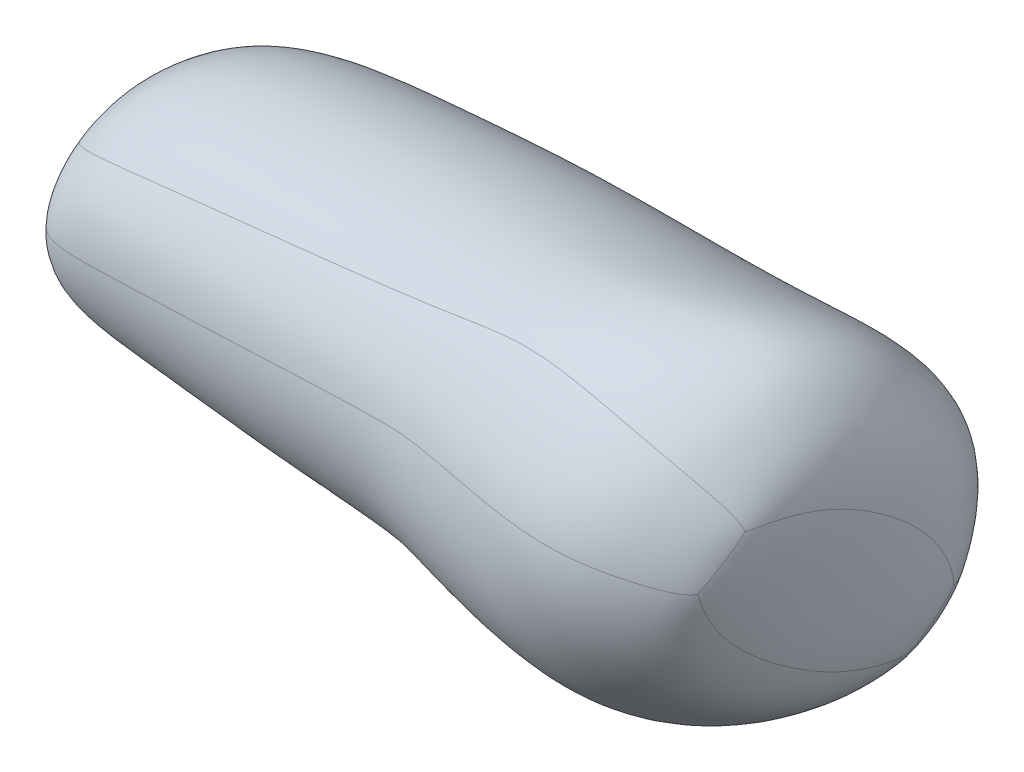
ISO-10303-21;
HEADER;
FILE_DESCRIPTION(('STEP AP214'),'2;1');
FILE_NAME('part.step','',(''),(''),'','','');
FILE_SCHEMA(('AUTOMOTIVE_DESIGN { 1 0 10303 214 1 1 1 1 }'));
ENDSEC;
DATA;
#1=APPLICATION_CONTEXT('core data for automotive mechanical design processes');
#2=APPLICATION_PROTOCOL_DEFINITION('international standard','automotive_design',2000,#1);
#3=PRODUCT_CONTEXT('',#1,'mechanical');
#4=PRODUCT('Part','Part','',(#3));
#5=PRODUCT_RELATED_PRODUCT_CATEGORY('part','',(#4));
#6=PRODUCT_DEFINITION_FORMATION('','',#4);
#7=PRODUCT_DEFINITION_CONTEXT('part definition',#1,'design');
#8=PRODUCT_DEFINITION('design','',#6,#7);
#9=PRODUCT_DEFINITION_SHAPE('','',#8);
#10=(LENGTH_UNIT() NAMED_UNIT(*) SI_UNIT(.MILLI.,.METRE.));
#11=(NAMED_UNIT(*) PLANE_ANGLE_UNIT() SI_UNIT($,.RADIAN.));
#12=(NAMED_UNIT(*) SI_UNIT($,.STERADIAN.) SOLID_ANGLE_UNIT());
#13=UNCERTAINTY_MEASURE_WITH_UNIT(LENGTH_MEASURE(1.E-05),#10,'distance_accuracy_value','');
#14=(GEOMETRIC_REPRESENTATION_CONTEXT(3) GLOBAL_UNCERTAINTY_ASSIGNED_CONTEXT((#13)) GLOBAL_UNIT_ASSIGNED_CONTEXT((#10,
#11,#12)) REPRESENTATION_CONTEXT('',''));
#15=CARTESIAN_POINT('',(0.,0.,0.));
#16=DIRECTION('',(0.,0.,1.));
#17=DIRECTION('',(1.,0.,0.));
#18=AXIS2_PLACEMENT_3D('',#15,#16,#17);
#19=CARTESIAN_POINT('',(-701.316035070471,1293.10943394566,-66.2994256879517));
#20=CARTESIAN_POINT('',(-701.628362751821,1293.05525842378,-65.9004162034461));
#21=CARTESIAN_POINT('',(-703.004641856583,1293.39929126228,-64.8374064802361));
#22=CARTESIAN_POINT('',(-706.461876633561,1294.08888908063,-63.3597857782156));
#23=CARTESIAN_POINT('',(-712.8462746859,1294.4758915348,-64.5136757659904));
#24=CARTESIAN_POINT('',(-715.279985083614,1294.04078869131,-64.9687179233393));
#25=CARTESIAN_POINT('',(-719.258570034694,1293.4376534686,-65.4506030178518));
#26=CARTESIAN_POINT('',(-723.565517325338,1292.80853719028,-65.8781008945618));
#27=CARTESIAN_POINT('',(-728.772502794879,1292.22176565615,-66.3143519553914));
#28=CARTESIAN_POINT('',(-732.617688854254,1291.85219883372,-66.5114804740266));
#29=CARTESIAN_POINT('',(-734.023346267989,1291.51385059072,-67.8652325400091));
#30=CARTESIAN_POINT('',(-734.498250658246,1291.38662519744,-70.3147613121822));
#31=CARTESIAN_POINT('',(-734.711399020064,1291.30984347028,-71.5942006821782));
#32=CARTESIAN_POINT('',(-734.731721017388,1291.35435848152,-71.866890666019));
#33=CARTESIAN_POINT('',(-701.259243366843,1292.62991775251,-66.3706867742273));
#34=CARTESIAN_POINT('',(-701.827107025942,1292.04205051556,-65.6439288914806));
#35=CARTESIAN_POINT('',(-703.292272627499,1292.16197347223,-64.491249850753));
#36=CARTESIAN_POINT('',(-706.897062603272,1292.41909062429,-62.9041161738302));
#37=CARTESIAN_POINT('',(-713.665879950692,1292.76977946586,-64.1805295441065));
#38=CARTESIAN_POINT('',(-715.725165791082,1292.48208956764,-64.7176039383368));
#39=CARTESIAN_POINT('',(-719.636619420401,1291.94516368584,-65.2689409016937));
#40=CARTESIAN_POINT('',(-723.941839959848,1291.36760342231,-65.7588164651027));
#41=CARTESIAN_POINT('',(-729.039819050765,1290.8927888255,-66.2707340060862));
#42=CARTESIAN_POINT('',(-732.698768894406,1290.623558216,-66.5204144837296));
#43=CARTESIAN_POINT('',(-734.058818220358,1290.50680640568,-67.857160743771));
#44=CARTESIAN_POINT('',(-734.518538885319,1290.7170169393,-70.3029220528484));
#45=CARTESIAN_POINT('',(-734.725513757758,1290.86549528866,-71.5864363447796));
#46=CARTESIAN_POINT('',(-734.748939384897,1291.15444189635,-71.9993534892401));
#47=CARTESIAN_POINT('',(-701.217421140593,1291.00795596354,-66.977315389934));
#48=CARTESIAN_POINT('',(-701.932547505376,1289.93134690237,-65.9494442454508));
#49=CARTESIAN_POINT('',(-703.537718974076,1289.64924805076,-64.7443405676878));
#50=CARTESIAN_POINT('',(-707.217521788779,1288.94036471283,-63.1121443146891));
#51=CARTESIAN_POINT('',(-714.416789764512,1289.30345667267,-64.6438524465018));
#52=CARTESIAN_POINT('',(-716.129813592438,1289.20821928462,-65.3027138007696));
#53=CARTESIAN_POINT('',(-720.034532553235,1288.78729253856,-65.8913603812614));
#54=CARTESIAN_POINT('',(-724.327485963588,1288.37709592915,-66.4467161505811));
#55=CARTESIAN_POINT('',(-729.214915005947,1288.20739179088,-67.0971392662938));
#56=CARTESIAN_POINT('',(-732.504733582318,1288.17758368197,-67.4535885793009));
#57=CARTESIAN_POINT('',(-733.916103426511,1288.50116506403,-68.6080783327037));
#58=CARTESIAN_POINT('',(-734.419809848835,1289.37407369262,-70.7589283159264));
#59=CARTESIAN_POINT('',(-734.663809182999,1289.97450057104,-71.8881637309372));
#60=CARTESIAN_POINT('',(-734.6835069016,1290.54916229157,-72.3228405724555));
#61=CARTESIAN_POINT('',(-700.711549450989,1288.90391840133,-69.2981814722913));
#62=CARTESIAN_POINT('',(-701.397823915827,1287.50799214454,-68.2179664249885));
#63=CARTESIAN_POINT('',(-703.001156894259,1286.38879569559,-67.3409021374589));
#64=CARTESIAN_POINT('',(-706.122730580127,1284.77173657121,-66.4203870104189));
#65=CARTESIAN_POINT('',(-713.095320425053,1285.10868732093,-68.1855474462987));
#66=CARTESIAN_POINT('',(-715.040298618289,1285.16321353457,-69.0318216299948));
#67=CARTESIAN_POINT('',(-719.120903766518,1285.02925848321,-69.6569251433747));
#68=CARTESIAN_POINT('',(-723.188924719288,1285.02097206484,-70.2699584252765));
#69=CARTESIAN_POINT('',(-728.134147969328,1285.31458013056,-70.9896361765153));
#70=CARTESIAN_POINT('',(-731.519390276312,1285.53221519774,-71.3637790681329));
#71=CARTESIAN_POINT('',(-733.373090938575,1286.36525136083,-71.7982036117811));
#72=CARTESIAN_POINT('',(-734.079150993543,1288.03572313809,-72.6867734449413));
#73=CARTESIAN_POINT('',(-734.442798515043,1289.09352451446,-73.1626858141456));
#74=CARTESIAN_POINT('',(-734.491354899545,1289.86781889685,-73.5022293845369));
#75=CARTESIAN_POINT('',(-699.966811510782,1287.44696455059,-72.1550714404489));
#76=CARTESIAN_POINT('',(-700.490059361611,1286.1695549403,-71.3681197746935));
#77=CARTESIAN_POINT('',(-701.801467118573,1284.91273596587,-71.3678842654787));
#78=CARTESIAN_POINT('',(-704.389616218064,1282.86288929533,-71.8094416367998));
#79=CARTESIAN_POINT('',(-710.682486461217,1283.35700947776,-73.0311918095691));
#80=CARTESIAN_POINT('',(-713.041786336386,1283.77799194608,-73.7949097808927));
#81=CARTESIAN_POINT('',(-717.221214515267,1284.07034510417,-74.5716058365903));
#82=CARTESIAN_POINT('',(-721.300971002899,1284.25717986953,-75.1359521184537));
#83=CARTESIAN_POINT('',(-726.525767802412,1284.60544441277,-75.7596968235506));
#84=CARTESIAN_POINT('',(-730.353243802895,1284.84975823516,-76.0871495095363));
#85=CARTESIAN_POINT('',(-732.811098613533,1285.83078595441,-75.6564519701284));
#86=CARTESIAN_POINT('',(-733.754506934189,1287.7358417964,-74.9985004428106));
#87=CARTESIAN_POINT('',(-734.225918043007,1288.89218061676,-74.6854459412886));
#88=CARTESIAN_POINT('',(-734.321538030255,1289.55539726438,-74.799217453363));
#89=CARTESIAN_POINT('',(-699.58905014994,1287.3591815318,-74.0646236030619));
#90=CARTESIAN_POINT('',(-699.97866310726,1286.5011170371,-73.6740222972994));
#91=CARTESIAN_POINT('',(-701.079144986726,1285.42643601934,-74.0694269703811));
#92=CARTESIAN_POINT('',(-703.437712279603,1283.70139021933,-75.2923243497656));
#93=CARTESIAN_POINT('',(-709.254490266171,1284.1601772422,-76.2319439783194));
#94=CARTESIAN_POINT('',(-712.155470572509,1284.81568204502,-76.6764852437867));
#95=CARTESIAN_POINT('',(-716.407387391016,1285.2155464126,-77.2396693097696));
#96=CARTESIAN_POINT('',(-720.574517719947,1285.37871579541,-77.6905786570233));
#97=CARTESIAN_POINT('',(-725.852690525938,1285.61893141926,-78.1031442284566));
#98=CARTESIAN_POINT('',(-729.901638764238,1285.72401953007,-78.3197520584858));
#99=CARTESIAN_POINT('',(-732.651396049921,1286.55661184503,-77.5021301569803));
#100=CARTESIAN_POINT('',(-733.664313391019,1288.24186873112,-76.1747904484819));
#101=CARTESIAN_POINT('',(-734.162794936604,1289.22484992857,-75.4594595538373));
#102=CARTESIAN_POINT('',(-734.274135288415,1289.6888738226,-75.396211902892));
#103=CARTESIAN_POINT('',(-699.575287960213,1287.43696934501,-74.5787932976504));
#104=CARTESIAN_POINT('',(-699.763213344005,1287.04683100427,-74.6405774920743));
#105=CARTESIAN_POINT('',(-700.783843905525,1286.13835350751,-75.2335867053734));
#106=CARTESIAN_POINT('',(-703.056649478199,1284.60291859489,-76.7532668022625));
#107=CARTESIAN_POINT('',(-708.620604907632,1285.02495852402,-77.5811180464579));
#108=CARTESIAN_POINT('',(-711.795978835133,1285.70234672374,-77.8880605737689));
#109=CARTESIAN_POINT('',(-716.071200328631,1286.09921821437,-78.3352984481417));
#110=CARTESIAN_POINT('',(-720.275608051449,1286.24189981291,-78.7042139385872));
#111=CARTESIAN_POINT('',(-725.58699145346,1286.41944472977,-79.0022239716751));
#112=CARTESIAN_POINT('',(-729.716143938538,1286.46125239289,-79.1494842894099));
#113=CARTESIAN_POINT('',(-732.586168783256,1287.16327454053,-78.1950573658623));
#114=CARTESIAN_POINT('',(-733.623951226821,1288.6523483878,-76.6259807180002));
#115=CARTESIAN_POINT('',(-734.13520712927,1289.49624284468,-75.7569089065667));
#116=CARTESIAN_POINT('',(-734.218629966255,1289.715127802,-75.6155940216934));
#117=(BOUNDED_SURFACE() B_SPLINE_SURFACE(3,3,((#19,#20,#21,#22,#23,#24,#25,#26,#27,#28,#29,#30,
#31,#32),(#33,#34,#35,#36,#37,#38,#39,#40,#41,#42,#43,#44,#45,#46),(#47,#48,#49,#50,#51,#52,#53,
#54,#55,#56,#57,#58,#59,#60),(#61,#62,#63,#64,#65,#66,#67,#68,#69,#70,#71,#72,#73,#74),(#75,#76,
#77,#78,#79,#80,#81,#82,#83,#84,#85,#86,#87,#88),(#89,#90,#91,#92,#93,#94,#95,#96,#97,#98,#99,
#100,#101,#102),(#103,#104,#105,#106,#107,#108,#109,#110,#111,#112,#113,#114,#115,#116)),
.UNSPECIFIED.,.F.,.F.,.F.) B_SPLINE_SURFACE_WITH_KNOTS((4,1,1,1,4),(4,1,1,1,1,1,1,1,1,1,1,4),
(0.,1.,2.,3.,4.),(0.,1.,2.,3.,4.,5.,6.,7.,8.,9.,10.,11.),
.UNSPECIFIED.) GEOMETRIC_REPRESENTATION_ITEM() RATIONAL_B_SPLINE_SURFACE(((0.75,1.,1.,1.,1.,1.,
1.,1.,1.,1.,1.,1.,1.,0.75),(1.,1.,1.,1.,1.,1.,1.,1.,1.,1.,1.,1.,1.,1.),(1.,1.,1.,1.,1.,1.,1.,1.,
1.,1.,1.,1.,1.,1.),(1.,1.,1.,1.,1.,1.,1.,1.,1.,1.,1.,1.,1.,1.),(1.,1.,1.,1.,1.,1.,1.,1.,1.,1.,
1.,1.,1.,1.),(1.,1.,1.,1.,1.,1.,1.,1.,1.,1.,1.,1.,1.,1.),(0.75,1.,1.,1.,1.,1.,1.,1.,1.,1.,1.,1.,
1.,0.75))) REPRESENTATION_ITEM('') SURFACE());
#118=CARTESIAN_POINT('',(-701.316035070471,1293.10943394566,-66.2994256879517));
#119=CARTESIAN_POINT('',(-701.259243366843,1292.62991775251,-66.3706867742273));
#120=CARTESIAN_POINT('',(-701.217421140593,1291.00795596354,-66.977315389934));
#121=CARTESIAN_POINT('',(-700.711549450989,1288.90391840133,-69.2981814722913));
#122=CARTESIAN_POINT('',(-699.966811510782,1287.44696455059,-72.1550714404489));
#123=CARTESIAN_POINT('',(-699.58905014994,1287.3591815318,-74.0646236030619));
#124=CARTESIAN_POINT('',(-699.575287960213,1287.43696934501,-74.5787932976504));
#125=(BOUNDED_CURVE() B_SPLINE_CURVE(3,(#118,#119,#120,#121,#122,#123,#124),.UNSPECIFIED.,.F.,
.F.) B_SPLINE_CURVE_WITH_KNOTS((4,1,1,1,4),(0.,1.,2.,3.,4.),
.UNSPECIFIED.) CURVE() GEOMETRIC_REPRESENTATION_ITEM() RATIONAL_B_SPLINE_CURVE((0.75,1.,1.,1.,
1.,1.,0.75)) REPRESENTATION_ITEM(''));
#126=CARTESIAN_POINT('',(-699.575287960213,1287.43696934501,-74.5787932976504));
#127=VERTEX_POINT('',#126);
#128=CARTESIAN_POINT('',(-701.316035070471,1293.10943394566,-66.2994256879517));
#129=VERTEX_POINT('',#128);
#130=EDGE_CURVE('E74',#127,#129,#125,.F.);
#131=CARTESIAN_POINT('',(-701.316035070471,1293.10943394566,-66.2994256879517));
#132=CARTESIAN_POINT('',(-701.628362751821,1293.05525842378,-65.9004162034461));
#133=CARTESIAN_POINT('',(-703.004641856583,1293.39929126228,-64.8374064802361));
#134=CARTESIAN_POINT('',(-706.461876633561,1294.08888908063,-63.3597857782156));
#135=CARTESIAN_POINT('',(-712.8462746859,1294.4758915348,-64.5136757659904));
#136=CARTESIAN_POINT('',(-715.279985083614,1294.04078869131,-64.9687179233393));
#137=CARTESIAN_POINT('',(-719.258570034694,1293.4376534686,-65.4506030178518));
#138=CARTESIAN_POINT('',(-723.565517325338,1292.80853719028,-65.8781008945618));
#139=CARTESIAN_POINT('',(-728.772502794879,1292.22176565615,-66.3143519553914));
#140=CARTESIAN_POINT('',(-732.617688854254,1291.85219883372,-66.5114804740266));
#141=CARTESIAN_POINT('',(-734.023346267989,1291.51385059072,-67.8652325400091));
#142=CARTESIAN_POINT('',(-734.498250658246,1291.38662519744,-70.3147613121822));
#143=CARTESIAN_POINT('',(-734.711399020064,1291.30984347028,-71.5942006821782));
#144=CARTESIAN_POINT('',(-734.731721017388,1291.35435848152,-71.866890666019));
#145=(BOUNDED_CURVE() B_SPLINE_CURVE(3,(#131,#132,#133,#134,#135,#136,#137,#138,#139,#140,#141,
#142,#143,#144),.UNSPECIFIED.,.F.,.F.) B_SPLINE_CURVE_WITH_KNOTS((4,1,1,1,1,1,1,1,1,1,1,4),(0.,
1.,2.,3.,4.,5.,6.,7.,8.,9.,10.,11.),
.UNSPECIFIED.) CURVE() GEOMETRIC_REPRESENTATION_ITEM() RATIONAL_B_SPLINE_CURVE((0.75,1.,1.,1.,
1.,1.,1.,1.,1.,1.,1.,1.,1.,0.75)) REPRESENTATION_ITEM(''));
#146=CARTESIAN_POINT('',(-734.731721017387,1291.35435848152,-71.8668906660189));
#147=VERTEX_POINT('',#146);
#148=EDGE_CURVE('E77',#129,#147,#145,.T.);
#149=CARTESIAN_POINT('',(-734.218629966255,1289.715127802,-75.6155940216934));
#150=CARTESIAN_POINT('',(-734.274135288415,1289.6888738226,-75.396211902892));
#151=CARTESIAN_POINT('',(-734.321538030255,1289.55539726438,-74.799217453363));
#152=CARTESIAN_POINT('',(-734.491354899545,1289.86781889685,-73.5022293845369));
#153=CARTESIAN_POINT('',(-734.6835069016,1290.54916229157,-72.3228405724555));
#154=CARTESIAN_POINT('',(-734.748939384897,1291.15444189635,-71.9993534892401));
#155=CARTESIAN_POINT('',(-734.731721017388,1291.35435848152,-71.866890666019));
#156=(BOUNDED_CURVE() B_SPLINE_CURVE(3,(#149,#150,#151,#152,#153,#154,#155),.UNSPECIFIED.,.F.,
.F.) B_SPLINE_CURVE_WITH_KNOTS((4,1,1,1,4),(0.,1.,2.,3.,4.),
.UNSPECIFIED.) CURVE() GEOMETRIC_REPRESENTATION_ITEM() RATIONAL_B_SPLINE_CURVE((0.75,1.,1.,1.,
1.,1.,0.75)) REPRESENTATION_ITEM(''));
#157=CARTESIAN_POINT('',(-734.218629966255,1289.715127802,-75.6155940216934));
#158=VERTEX_POINT('',#157);
#159=EDGE_CURVE('E92',#147,#158,#156,.F.);
#160=CARTESIAN_POINT('',(-699.575287960213,1287.43696934501,-74.5787932976504));
#161=CARTESIAN_POINT('',(-699.763213344005,1287.04683100427,-74.6405774920743));
#162=CARTESIAN_POINT('',(-700.783843905525,1286.13835350751,-75.2335867053734));
#163=CARTESIAN_POINT('',(-703.056649478199,1284.60291859489,-76.7532668022625));
#164=CARTESIAN_POINT('',(-708.620604907632,1285.02495852402,-77.5811180464579));
#165=CARTESIAN_POINT('',(-711.795978835133,1285.70234672374,-77.8880605737689));
#166=CARTESIAN_POINT('',(-716.071200328631,1286.09921821437,-78.3352984481417));
#167=CARTESIAN_POINT('',(-720.275608051449,1286.24189981291,-78.7042139385872));
#168=CARTESIAN_POINT('',(-725.58699145346,1286.41944472977,-79.0022239716751));
#169=CARTESIAN_POINT('',(-729.716143938538,1286.46125239289,-79.1494842894099));
#170=CARTESIAN_POINT('',(-732.586168783256,1287.16327454053,-78.1950573658623));
#171=CARTESIAN_POINT('',(-733.623951226821,1288.6523483878,-76.6259807180002));
#172=CARTESIAN_POINT('',(-734.13520712927,1289.49624284468,-75.7569089065667));
#173=CARTESIAN_POINT('',(-734.218629966255,1289.715127802,-75.6155940216934));
#174=(BOUNDED_CURVE() B_SPLINE_CURVE(3,(#160,#161,#162,#163,#164,#165,#166,#167,#168,#169,#170,
#171,#172,#173),.UNSPECIFIED.,.F.,.F.) B_SPLINE_CURVE_WITH_KNOTS((4,1,1,1,1,1,1,1,1,1,1,4),(0.,
1.,2.,3.,4.,5.,6.,7.,8.,9.,10.,11.),
.UNSPECIFIED.) CURVE() GEOMETRIC_REPRESENTATION_ITEM() RATIONAL_B_SPLINE_CURVE((0.75,1.,1.,1.,
1.,1.,1.,1.,1.,1.,1.,1.,1.,0.75)) REPRESENTATION_ITEM(''));
#175=EDGE_CURVE('E78',#158,#127,#174,.F.);
#176=ORIENTED_EDGE('',*,*,#130,.T.);
#177=ORIENTED_EDGE('',*,*,#148,.T.);
#178=ORIENTED_EDGE('',*,*,#159,.T.);
#179=ORIENTED_EDGE('',*,*,#175,.T.);
#180=EDGE_LOOP('',(#176,#177,#178,#179));
#181=FACE_BOUND('',#180,.T.);
#182=ADVANCED_FACE('F33',(#181),#117,.F.);
#183=CARTESIAN_POINT('',(-701.316035070471,1293.10943394566,-66.2994256879517));
#184=CARTESIAN_POINT('',(-701.259243366843,1292.62991775251,-66.3706867742273));
#185=CARTESIAN_POINT('',(-701.217421140593,1291.00795596354,-66.977315389934));
#186=CARTESIAN_POINT('',(-700.711549450989,1288.90391840133,-69.2981814722913));
#187=CARTESIAN_POINT('',(-699.966811510782,1287.44696455059,-72.1550714404489));
#188=CARTESIAN_POINT('',(-699.58905014994,1287.3591815318,-74.0646236030619));
#189=CARTESIAN_POINT('',(-699.575287960213,1287.43696934501,-74.5787932976504));
#190=CARTESIAN_POINT('',(-701.06049909274,1293.64312566072,-66.6271740862035));
#191=CARTESIAN_POINT('',(-700.691379707763,1293.21778498944,-67.0974446569739));
#192=CARTESIAN_POINT('',(-700.502294775801,1292.08456502469,-68.005186534439));
#193=CARTESIAN_POINT('',(-700.025274986141,1290.29984465812,-70.3783965195941));
#194=CARTESIAN_POINT('',(-699.443563659961,1288.72437416087,-72.9420231062152));
#195=CARTESIAN_POINT('',(-699.19943719263,1288.21724602649,-74.4552249088026));
#196=CARTESIAN_POINT('',(-699.373600386694,1287.90489549896,-75.0311787978259));
#197=CARTESIAN_POINT('',(-700.686542679787,1294.74650564173,-67.3986283592126));
#198=CARTESIAN_POINT('',(-700.288235190351,1294.45348094167,-67.9746209021196));
#199=CARTESIAN_POINT('',(-699.874627780548,1294.09673372122,-69.458376984546));
#200=CARTESIAN_POINT('',(-699.454392545671,1292.53209894724,-72.1002944704513));
#201=CARTESIAN_POINT('',(-699.052771836792,1290.65078389422,-74.5158086831402));
#202=CARTESIAN_POINT('',(-698.970452217746,1289.39603450697,-75.4341298568684));
#203=CARTESIAN_POINT('',(-699.171507199592,1288.95711318216,-75.9107108359875));
#204=CARTESIAN_POINT('',(-700.585708481574,1295.27921373727,-67.8170571907443));
#205=CARTESIAN_POINT('',(-700.336137637736,1295.39905543499,-68.3142678779746));
#206=CARTESIAN_POINT('',(-699.77329215724,1295.55471740146,-70.2216926557849));
#207=CARTESIAN_POINT('',(-699.354604693432,1294.0811348502,-73.2496878926493));
#208=CARTESIAN_POINT('',(-699.038835147238,1291.82827702228,-75.685784690865));
#209=CARTESIAN_POINT('',(-699.055162779194,1290.01359185963,-76.2488420259764));
#210=CARTESIAN_POINT('',(-699.160962579936,1289.5151251922,-76.2949919556829));
#211=(BOUNDED_SURFACE() B_SPLINE_SURFACE(3,3,((#183,#184,#185,#186,#187,#188,#189),(#190,#191,
#192,#193,#194,#195,#196),(#197,#198,#199,#200,#201,#202,#203),(#204,#205,#206,#207,#208,#209,
#210)),.UNSPECIFIED.,.F.,.F.,.F.) B_SPLINE_SURFACE_WITH_KNOTS((4,4),(4,1,1,1,4),(0.,1.),(0.,1.,
2.,3.,4.),.UNSPECIFIED.) GEOMETRIC_REPRESENTATION_ITEM() RATIONAL_B_SPLINE_SURFACE(((0.75,1.,1.,
1.,1.,1.,0.75),(1.,1.,1.,1.,1.,1.,1.),(1.,1.,1.,1.,1.,1.,1.),(0.75,1.,1.,1.,1.,1.,0.75))) REPRESENTATION_ITEM('') SURFACE());
#212=CARTESIAN_POINT('',(-701.316035070471,1293.10943394566,-66.2994256879517));
#213=CARTESIAN_POINT('',(-701.06049909274,1293.64312566072,-66.6271740862035));
#214=CARTESIAN_POINT('',(-700.686542679787,1294.74650564173,-67.3986283592126));
#215=CARTESIAN_POINT('',(-700.585708481574,1295.27921373727,-67.8170571907443));
#216=(BOUNDED_CURVE() B_SPLINE_CURVE(3,(#212,#213,#214,#215),.UNSPECIFIED.,.F.,
.F.) B_SPLINE_CURVE_WITH_KNOTS((4,4),(0.,1.),
.UNSPECIFIED.) CURVE() GEOMETRIC_REPRESENTATION_ITEM() RATIONAL_B_SPLINE_CURVE((0.75,1.,1.,0.75)) REPRESENTATION_ITEM(''));
#217=CARTESIAN_POINT('',(-700.585708481574,1295.27921373727,-67.8170571907443));
#218=VERTEX_POINT('',#217);
#219=EDGE_CURVE('E87',#218,#129,#216,.F.);
#220=CARTESIAN_POINT('',(-699.160962579936,1289.5151251922,-76.2949919556829));
#221=CARTESIAN_POINT('',(-699.171507199592,1288.95711318216,-75.9107108359875));
#222=CARTESIAN_POINT('',(-699.373600386694,1287.90489549896,-75.0311787978259));
#223=CARTESIAN_POINT('',(-699.575287960213,1287.43696934501,-74.5787932976504));
#224=(BOUNDED_CURVE() B_SPLINE_CURVE(3,(#220,#221,#222,#223),.UNSPECIFIED.,.F.,
.F.) B_SPLINE_CURVE_WITH_KNOTS((4,4),(0.,1.),
.UNSPECIFIED.) CURVE() GEOMETRIC_REPRESENTATION_ITEM() RATIONAL_B_SPLINE_CURVE((0.75,1.,1.,0.75)) REPRESENTATION_ITEM(''));
#225=CARTESIAN_POINT('',(-699.160962579936,1289.5151251922,-76.2949919556829));
#226=VERTEX_POINT('',#225);
#227=EDGE_CURVE('E82',#127,#226,#224,.F.);
#228=CARTESIAN_POINT('',(-700.585708481574,1295.27921373727,-67.8170571907443));
#229=CARTESIAN_POINT('',(-700.336137637736,1295.39905543499,-68.3142678779746));
#230=CARTESIAN_POINT('',(-699.77329215724,1295.55471740146,-70.2216926557849));
#231=CARTESIAN_POINT('',(-699.354604693432,1294.0811348502,-73.2496878926493));
#232=CARTESIAN_POINT('',(-699.038835147238,1291.82827702228,-75.685784690865));
#233=CARTESIAN_POINT('',(-699.055162779194,1290.01359185963,-76.2488420259764));
#234=CARTESIAN_POINT('',(-699.160962579936,1289.5151251922,-76.2949919556829));
#235=(BOUNDED_CURVE() B_SPLINE_CURVE(3,(#228,#229,#230,#231,#232,#233,#234),.UNSPECIFIED.,.F.,
.F.) B_SPLINE_CURVE_WITH_KNOTS((4,1,1,1,4),(0.,1.,2.,3.,4.),
.UNSPECIFIED.) CURVE() GEOMETRIC_REPRESENTATION_ITEM() RATIONAL_B_SPLINE_CURVE((0.75,1.,1.,1.,
1.,1.,0.75)) REPRESENTATION_ITEM(''));
#236=EDGE_CURVE('E54',#226,#218,#235,.F.);
#237=ORIENTED_EDGE('',*,*,#219,.T.);
#238=ORIENTED_EDGE('',*,*,#130,.F.);
#239=ORIENTED_EDGE('',*,*,#227,.T.);
#240=ORIENTED_EDGE('',*,*,#236,.T.);
#241=EDGE_LOOP('',(#237,#238,#239,#240));
#242=FACE_BOUND('',#241,.T.);
#243=ADVANCED_FACE('F91',(#242),#211,.F.);
#244=CARTESIAN_POINT('',(-699.160962579936,1289.5151251922,-76.2949919556829));
#245=CARTESIAN_POINT('',(-699.171507199592,1288.95711318216,-75.9107108359875));
#246=CARTESIAN_POINT('',(-699.373600386694,1287.90489549896,-75.0311787978259));
#247=CARTESIAN_POINT('',(-699.575287960213,1287.43696934501,-74.5787932976504));
#248=CARTESIAN_POINT('',(-699.256217761031,1289.57467053482,-76.7254230051065));
#249=CARTESIAN_POINT('',(-699.372562181429,1288.51819185734,-76.3872918150959));
#250=CARTESIAN_POINT('',(-699.547763580759,1287.59254497142,-75.6071326868491));
#251=CARTESIAN_POINT('',(-699.763213344005,1287.04683100427,-74.6405774920743));
#252=CARTESIAN_POINT('',(-700.097893632024,1289.3805288036,-77.8699437666638));
#253=CARTESIAN_POINT('',(-700.259101727833,1288.01725594529,-77.3752945578557));
#254=CARTESIAN_POINT('',(-700.488542824323,1286.85027099569,-76.397746440344));
#255=CARTESIAN_POINT('',(-700.783843905525,1286.13835350751,-75.2335867053734));
#256=CARTESIAN_POINT('',(-702.194337470238,1288.49079086063,-79.9636994310501));
#257=CARTESIAN_POINT('',(-702.389413043223,1286.88825325962,-79.3946528033031));
#258=CARTESIAN_POINT('',(-702.675586676805,1285.50444697047,-78.2142092547703));
#259=CARTESIAN_POINT('',(-703.056649478199,1284.60291859489,-76.7532668022625));
#260=CARTESIAN_POINT('',(-706.986781111785,1288.74595116608,-80.4862409726966));
#261=CARTESIAN_POINT('',(-707.432946929513,1287.21771848724,-80.0282641665093));
#262=CARTESIAN_POINT('',(-707.986719549083,1285.88973980583,-78.9302921145965));
#263=CARTESIAN_POINT('',(-708.620604907632,1285.02495852402,-77.5811180464579));
#264=CARTESIAN_POINT('',(-710.917102500869,1289.25740710116,-80.4849175945342));
#265=CARTESIAN_POINT('',(-711.160661504976,1287.8434957104,-80.0819988322576));
#266=CARTESIAN_POINT('',(-711.436487097766,1286.58901140245,-79.099635903762));
#267=CARTESIAN_POINT('',(-711.795978835133,1285.70234672374,-77.8880605737689));
#268=CARTESIAN_POINT('',(-715.247155589258,1289.51284040868,-80.6322349209039));
#269=CARTESIAN_POINT('',(-715.469552703633,1288.17763296547,-80.2881541267167));
#270=CARTESIAN_POINT('',(-715.735013266264,1286.98289001614,-79.4309275865352));
#271=CARTESIAN_POINT('',(-716.071200328631,1286.09921821437,-78.3352984481417));
#272=CARTESIAN_POINT('',(-719.552571863473,1289.56790925822,-80.7542563143154));
#273=CARTESIAN_POINT('',(-719.742105687389,1288.27068390248,-80.4678065140055));
#274=CARTESIAN_POINT('',(-719.976698382942,1287.10508383041,-79.7178492201512));
#275=CARTESIAN_POINT('',(-720.275608051449,1286.24189981291,-78.7042139385872));
#276=CARTESIAN_POINT('',(-724.987454944093,1289.53868939169,-80.7287042475711));
#277=CARTESIAN_POINT('',(-725.126432874266,1288.314241158,-80.5277394988724));
#278=CARTESIAN_POINT('',(-725.321292380973,1287.21995804026,-79.9013037148938));
#279=CARTESIAN_POINT('',(-725.58699145346,1286.41944472977,-79.0022239716751));
#280=CARTESIAN_POINT('',(-729.310788169767,1289.40940228765,-80.6643315627359));
#281=CARTESIAN_POINT('',(-729.385461980771,1288.2358203339,-80.5223797077021));
#282=CARTESIAN_POINT('',(-729.530649112838,1287.19848525571,-79.979216520334));
#283=CARTESIAN_POINT('',(-729.716143938538,1286.46125239289,-79.1494842894099));
#284=CARTESIAN_POINT('',(-732.445843239205,1289.5793740466,-79.4832813183395));
#285=CARTESIAN_POINT('',(-732.470338265085,1288.62034968172,-79.3509998990929));
#286=CARTESIAN_POINT('',(-732.5209415166,1287.76993723604,-78.8879845747442));
#287=CARTESIAN_POINT('',(-732.586168783256,1287.16327454053,-78.1950573658623));
#288=CARTESIAN_POINT('',(-733.525867202672,1290.2629573503,-77.4910472928263));
#289=CARTESIAN_POINT('',(-733.547961505791,1289.63077389044,-77.3914065237414));
#290=CARTESIAN_POINT('',(-733.583589062615,1289.06282804445,-77.0771709875186));
#291=CARTESIAN_POINT('',(-733.623951226821,1288.6523483878,-76.6259807180002));
#292=CARTESIAN_POINT('',(-734.070083280794,1290.56323763536,-76.3280079371821));
#293=CARTESIAN_POINT('',(-734.084005260469,1290.14408693711,-76.2622501585134));
#294=CARTESIAN_POINT('',(-734.107619321935,1289.76763576079,-76.0543582593179));
#295=CARTESIAN_POINT('',(-734.13520712927,1289.49624284468,-75.7569089065667));
#296=CARTESIAN_POINT('',(-734.166360710901,1290.57197672558,-76.0733834239158));
#297=CARTESIAN_POINT('',(-734.221460415774,1290.36677092157,-75.9131922779539));
#298=CARTESIAN_POINT('',(-734.24654748108,1289.96026673872,-75.6936612556323));
#299=CARTESIAN_POINT('',(-734.218629966255,1289.715127802,-75.6155940216934));
#300=(BOUNDED_SURFACE() B_SPLINE_SURFACE(3,3,((#244,#245,#246,#247),(#248,#249,#250,#251),(#252,
#253,#254,#255),(#256,#257,#258,#259),(#260,#261,#262,#263),(#264,#265,#266,#267),(#268,#269,
#270,#271),(#272,#273,#274,#275),(#276,#277,#278,#279),(#280,#281,#282,#283),(#284,#285,#286,
#287),(#288,#289,#290,#291),(#292,#293,#294,#295),(#296,#297,#298,#299)),.UNSPECIFIED.,.F.,.F.,
.F.) B_SPLINE_SURFACE_WITH_KNOTS((4,1,1,1,1,1,1,1,1,1,1,4),(4,4),(0.,1.,2.,3.,4.,5.,6.,7.,8.,9.,
10.,11.),(0.,1.),
.UNSPECIFIED.) GEOMETRIC_REPRESENTATION_ITEM() RATIONAL_B_SPLINE_SURFACE(((0.75,1.,1.,0.75),(1.,
1.,1.,1.),(1.,1.,1.,1.),(1.,1.,1.,1.),(1.,1.,1.,1.),(1.,1.,1.,1.),(1.,1.,1.,1.),(1.,1.,1.,1.),
(1.,1.,1.,1.),(1.,1.,1.,1.),(1.,1.,1.,1.),(1.,1.,1.,1.),(1.,1.,1.,1.),(0.75,1.,1.,0.75))) REPRESENTATION_ITEM('') SURFACE());
#301=CARTESIAN_POINT('',(-699.160962579936,1289.5151251922,-76.2949919556829));
#302=CARTESIAN_POINT('',(-699.256217761031,1289.57467053482,-76.7254230051065));
#303=CARTESIAN_POINT('',(-700.097893632024,1289.3805288036,-77.8699437666638));
#304=CARTESIAN_POINT('',(-702.194337470238,1288.49079086063,-79.9636994310501));
#305=CARTESIAN_POINT('',(-706.986781111785,1288.74595116608,-80.4862409726966));
#306=CARTESIAN_POINT('',(-710.917102500869,1289.25740710116,-80.4849175945342));
#307=CARTESIAN_POINT('',(-715.247155589258,1289.51284040868,-80.6322349209039));
#308=CARTESIAN_POINT('',(-719.552571863473,1289.56790925822,-80.7542563143154));
#309=CARTESIAN_POINT('',(-724.987454944093,1289.53868939169,-80.7287042475711));
#310=CARTESIAN_POINT('',(-729.310788169767,1289.40940228765,-80.6643315627359));
#311=CARTESIAN_POINT('',(-732.445843239205,1289.5793740466,-79.4832813183395));
#312=CARTESIAN_POINT('',(-733.525867202672,1290.2629573503,-77.4910472928263));
#313=CARTESIAN_POINT('',(-734.070083280794,1290.56323763536,-76.3280079371821));
#314=CARTESIAN_POINT('',(-734.166360710901,1290.57197672558,-76.0733834239158));
#315=(BOUNDED_CURVE() B_SPLINE_CURVE(3,(#301,#302,#303,#304,#305,#306,#307,#308,#309,#310,#311,
#312,#313,#314),.UNSPECIFIED.,.F.,.F.) B_SPLINE_CURVE_WITH_KNOTS((4,1,1,1,1,1,1,1,1,1,1,4),(0.,
1.,2.,3.,4.,5.,6.,7.,8.,9.,10.,11.),
.UNSPECIFIED.) CURVE() GEOMETRIC_REPRESENTATION_ITEM() RATIONAL_B_SPLINE_CURVE((0.75,1.,1.,1.,
1.,1.,1.,1.,1.,1.,1.,1.,1.,0.75)) REPRESENTATION_ITEM(''));
#316=CARTESIAN_POINT('',(-734.166360710901,1290.57197672558,-76.0733834239158));
#317=VERTEX_POINT('',#316);
#318=EDGE_CURVE('E114',#317,#226,#315,.F.);
#319=CARTESIAN_POINT('',(-734.166360710901,1290.57197672558,-76.0733834239158));
#320=CARTESIAN_POINT('',(-734.221460415774,1290.36677092157,-75.9131922779539));
#321=CARTESIAN_POINT('',(-734.24654748108,1289.96026673872,-75.6936612556323));
#322=CARTESIAN_POINT('',(-734.218629966255,1289.715127802,-75.6155940216934));
#323=(BOUNDED_CURVE() B_SPLINE_CURVE(3,(#319,#320,#321,#322),.UNSPECIFIED.,.F.,
.F.) B_SPLINE_CURVE_WITH_KNOTS((4,4),(0.,1.),
.UNSPECIFIED.) CURVE() GEOMETRIC_REPRESENTATION_ITEM() RATIONAL_B_SPLINE_CURVE((0.75,1.,1.,0.75)) REPRESENTATION_ITEM(''));
#324=EDGE_CURVE('E94',#158,#317,#323,.F.);
#325=ORIENTED_EDGE('',*,*,#318,.T.);
#326=ORIENTED_EDGE('',*,*,#227,.F.);
#327=ORIENTED_EDGE('',*,*,#175,.F.);
#328=ORIENTED_EDGE('',*,*,#324,.T.);
#329=EDGE_LOOP('',(#325,#326,#327,#328));
#330=FACE_BOUND('',#329,.T.);
#331=ADVANCED_FACE('F148',(#330),#300,.F.);
#332=CARTESIAN_POINT('',(-734.166360710901,1290.57197672558,-76.0733834239158));
#333=CARTESIAN_POINT('',(-734.221460415774,1290.36677092157,-75.9131922779539));
#334=CARTESIAN_POINT('',(-734.24654748108,1289.96026673872,-75.6936612556323));
#335=CARTESIAN_POINT('',(-734.218629966255,1289.715127802,-75.6155940216934));
#336=CARTESIAN_POINT('',(-734.207538436099,1290.78592161981,-75.9789500566226));
#337=CARTESIAN_POINT('',(-734.358915571078,1290.589454906,-75.5641343973944));
#338=CARTESIAN_POINT('',(-734.385475640226,1290.15289771664,-75.3329642519467));
#339=CARTESIAN_POINT('',(-734.274135288415,1289.6888738226,-75.396211902892));
#340=CARTESIAN_POINT('',(-734.210196971477,1291.43648328551,-75.7690361362599));
#341=CARTESIAN_POINT('',(-734.37269243759,1290.96687779706,-75.2970592403739));
#342=CARTESIAN_POINT('',(-734.417158017494,1290.218613912,-74.9129889654482));
#343=CARTESIAN_POINT('',(-734.321538030255,1289.55539726438,-74.799217453363));
#344=CARTESIAN_POINT('',(-734.278979805671,1292.43149163141,-74.6169119260695));
#345=CARTESIAN_POINT('',(-734.455200292259,1291.66180135578,-74.2829039111255));
#346=CARTESIAN_POINT('',(-734.539911284028,1290.64211327922,-73.8417729549393));
#347=CARTESIAN_POINT('',(-734.491354899545,1289.86781889685,-73.5022293845369));
#348=CARTESIAN_POINT('',(-734.475661321086,1292.68136163711,-73.0922671403434));
#349=CARTESIAN_POINT('',(-734.620600390349,1291.97293401397,-73.0622533895212));
#350=CARTESIAN_POINT('',(-734.70320462022,1291.1238240121,-72.7575174139845));
#351=CARTESIAN_POINT('',(-734.6835069016,1290.54916229157,-72.3228405724555));
#352=CARTESIAN_POINT('',(-734.60602504261,1292.41868270264,-72.4634706219471));
#353=CARTESIAN_POINT('',(-734.715728830085,1291.94704254474,-72.5963477766776));
#354=CARTESIAN_POINT('',(-734.772365012036,1291.44338850406,-72.4122706337113));
#355=CARTESIAN_POINT('',(-734.748939384897,1291.15444189635,-71.9993534892401));
#356=CARTESIAN_POINT('',(-734.616750868263,1292.34491868718,-72.231766210431));
#357=CARTESIAN_POINT('',(-734.676965674832,1292.07221660051,-72.1823525820436));
#358=CARTESIAN_POINT('',(-734.734824647203,1291.59879007796,-72.0071178266386));
#359=CARTESIAN_POINT('',(-734.731721017388,1291.35435848152,-71.866890666019));
#360=(BOUNDED_SURFACE() B_SPLINE_SURFACE(3,3,((#332,#333,#334,#335),(#336,#337,#338,#339),(#340,
#341,#342,#343),(#344,#345,#346,#347),(#348,#349,#350,#351),(#352,#353,#354,#355),(#356,#357,
#358,#359)),.UNSPECIFIED.,.F.,.F.,.F.) B_SPLINE_SURFACE_WITH_KNOTS((4,1,1,1,4),(4,4),(0.,1.,2.,
3.,4.),(0.,1.),.UNSPECIFIED.) GEOMETRIC_REPRESENTATION_ITEM() RATIONAL_B_SPLINE_SURFACE(((0.75,
1.,1.,0.75),(1.,1.,1.,1.),(1.,1.,1.,1.),(1.,1.,1.,1.),(1.,1.,1.,1.),(1.,1.,1.,1.),(0.75,1.,1.,0.75))) REPRESENTATION_ITEM('') SURFACE());
#361=CARTESIAN_POINT('',(-734.616750868263,1292.34491868718,-72.231766210431));
#362=CARTESIAN_POINT('',(-734.60602504261,1292.41868270264,-72.4634706219471));
#363=CARTESIAN_POINT('',(-734.475661321086,1292.68136163711,-73.0922671403434));
#364=CARTESIAN_POINT('',(-734.278979805671,1292.43149163141,-74.6169119260695));
#365=CARTESIAN_POINT('',(-734.210196971477,1291.43648328551,-75.7690361362599));
#366=CARTESIAN_POINT('',(-734.207538436099,1290.78592161981,-75.9789500566226));
#367=CARTESIAN_POINT('',(-734.166360710901,1290.57197672558,-76.0733834239158));
#368=(BOUNDED_CURVE() B_SPLINE_CURVE(3,(#361,#362,#363,#364,#365,#366,#367),.UNSPECIFIED.,.F.,
.F.) B_SPLINE_CURVE_WITH_KNOTS((4,1,1,1,4),(0.,1.,2.,3.,4.),
.UNSPECIFIED.) CURVE() GEOMETRIC_REPRESENTATION_ITEM() RATIONAL_B_SPLINE_CURVE((0.75,1.,1.,1.,
1.,1.,0.75)) REPRESENTATION_ITEM(''));
#369=CARTESIAN_POINT('',(-734.616750868263,1292.34491868718,-72.231766210431));
#370=VERTEX_POINT('',#369);
#371=EDGE_CURVE('E46',#370,#317,#368,.T.);
#372=CARTESIAN_POINT('',(-734.731721017388,1291.35435848152,-71.866890666019));
#373=CARTESIAN_POINT('',(-734.734824647203,1291.59879007796,-72.0071178266386));
#374=CARTESIAN_POINT('',(-734.676965674832,1292.07221660051,-72.1823525820436));
#375=CARTESIAN_POINT('',(-734.616750868263,1292.34491868718,-72.231766210431));
#376=(BOUNDED_CURVE() B_SPLINE_CURVE(3,(#372,#373,#374,#375),.UNSPECIFIED.,.F.,
.F.) B_SPLINE_CURVE_WITH_KNOTS((4,4),(0.,1.),
.UNSPECIFIED.) CURVE() GEOMETRIC_REPRESENTATION_ITEM() RATIONAL_B_SPLINE_CURVE((0.75,1.,1.,0.75)) REPRESENTATION_ITEM(''));
#377=EDGE_CURVE('E89',#147,#370,#376,.T.);
#378=ORIENTED_EDGE('',*,*,#371,.T.);
#379=ORIENTED_EDGE('',*,*,#324,.F.);
#380=ORIENTED_EDGE('',*,*,#159,.F.);
#381=ORIENTED_EDGE('',*,*,#377,.T.);
#382=EDGE_LOOP('',(#378,#379,#380,#381));
#383=FACE_BOUND('',#382,.T.);
#384=ADVANCED_FACE('F146',(#383),#360,.F.);
#385=CARTESIAN_POINT('',(-701.316035070471,1293.10943394566,-66.2994256879517));
#386=CARTESIAN_POINT('',(-701.06049909274,1293.64312566072,-66.6271740862035));
#387=CARTESIAN_POINT('',(-700.686542679787,1294.74650564173,-67.3986283592126));
#388=CARTESIAN_POINT('',(-700.585708481574,1295.27921373727,-67.8170571907443));
#389=CARTESIAN_POINT('',(-701.628362751821,1293.05525842378,-65.9004162034461));
#390=CARTESIAN_POINT('',(-701.429618477709,1294.06846633199,-66.1569035154006));
#391=CARTESIAN_POINT('',(-701.084850169214,1295.03953034181,-66.8226358163165));
#392=CARTESIAN_POINT('',(-700.734445127173,1295.69208013507,-67.7382753350675));
#393=CARTESIAN_POINT('',(-703.004641856583,1293.39929126228,-64.8374064802361));
#394=CARTESIAN_POINT('',(-702.717011085677,1294.63660905233,-65.1835631097191));
#395=CARTESIAN_POINT('',(-702.264472717159,1295.85488192169,-66.0024217271363));
#396=CARTESIAN_POINT('',(-701.823205813304,1296.75520895946,-67.1302859970417));
#397=CARTESIAN_POINT('',(-706.461876633561,1294.08888908063,-63.3597857782156));
#398=CARTESIAN_POINT('',(-706.02669066384,1295.75868753699,-63.8154553826119));
#399=CARTESIAN_POINT('',(-705.316548317151,1297.35892149395,-64.8308086618177));
#400=CARTESIAN_POINT('',(-704.634820800396,1298.50182432532,-66.1980134187879));
#401=CARTESIAN_POINT('',(-712.8462746859,1294.4758915348,-64.5136757659904));
#402=CARTESIAN_POINT('',(-712.026669421109,1296.18200360374,-64.8468219878743));
#403=CARTESIAN_POINT('',(-710.76291379845,1297.861066345,-65.7447758828234));
#404=CARTESIAN_POINT('',(-709.681848792816,1298.9273024365,-66.87301686522));
#405=CARTESIAN_POINT('',(-715.279985083614,1294.04078869131,-64.9687179233393));
#406=CARTESIAN_POINT('',(-714.834804376137,1295.59948781498,-65.2198319083419));
#407=CARTESIAN_POINT('',(-714.146766861865,1297.07995092081,-66.0146148095688));
#408=CARTESIAN_POINT('',(-713.487068632728,1298.05688639125,-67.0579901826022));
#409=CARTESIAN_POINT('',(-719.258570034694,1293.4376534686,-65.4506030178518));
#410=CARTESIAN_POINT('',(-718.880520648967,1294.93014325135,-65.63226513401));
#411=CARTESIAN_POINT('',(-718.323378443947,1296.33618724321,-66.3067991061048));
#412=CARTESIAN_POINT('',(-717.773999477879,1297.31407206392,-67.2672933525121));
#413=CARTESIAN_POINT('',(-723.565517325338,1292.80853719028,-65.8781008945618));
#414=CARTESIAN_POINT('',(-723.189194690827,1294.24947095823,-65.9973853240101));
#415=CARTESIAN_POINT('',(-722.629372423658,1295.63608474755,-66.5799040256513));
#416=CARTESIAN_POINT('',(-722.07861739844,1296.65269953115,-67.4745904260245));
#417=CARTESIAN_POINT('',(-728.772502794879,1292.22176565615,-66.3143519553914));
#418=CARTESIAN_POINT('',(-728.505186538984,1293.55074248679,-66.3579699047075));
#419=CARTESIAN_POINT('',(-728.058102004803,1294.86599763075,-66.8584084334271));
#420=CARTESIAN_POINT('',(-727.587276699018,1295.88152383269,-67.6834641211513));
#421=CARTESIAN_POINT('',(-732.617688854254,1291.85219883372,-66.5114804740266));
#422=CARTESIAN_POINT('',(-732.536608814101,1293.08083945145,-66.5025464643236));
#423=CARTESIAN_POINT('',(-732.277431077771,1294.31513341988,-66.9512654926976));
#424=CARTESIAN_POINT('',(-731.961052938884,1295.29204309672,-67.7436277297251));
#425=CARTESIAN_POINT('',(-734.023346267989,1291.51385059072,-67.8652325400091));
#426=CARTESIAN_POINT('',(-733.98787431563,1292.52089477578,-67.8733043362472));
#427=CARTESIAN_POINT('',(-733.845573013947,1293.53216247504,-68.2649067231576));
#428=CARTESIAN_POINT('',(-733.676765176044,1294.33096938815,-68.9368566332032));
#429=CARTESIAN_POINT('',(-734.498250658246,1291.38662519744,-70.3147613121822));
#430=CARTESIAN_POINT('',(-734.477962431164,1292.0562334556,-70.3266005715053));
#431=CARTESIAN_POINT('',(-734.388021458762,1292.72397834856,-70.5782822217174));
#432=CARTESIAN_POINT('',(-734.279399963912,1293.24677687964,-71.0046063920618));
#433=CARTESIAN_POINT('',(-734.711399020064,1291.30984347028,-71.5942006821782));
#434=CARTESIAN_POINT('',(-734.69728428236,1291.75419165187,-71.6019650195552));
#435=CARTESIAN_POINT('',(-734.638202519559,1292.19739065627,-71.7683573874097));
#436=CARTESIAN_POINT('',(-734.567261887338,1292.5438567584,-72.0494754273241));
#437=CARTESIAN_POINT('',(-734.731721017388,1291.35435848152,-71.866890666019));
#438=CARTESIAN_POINT('',(-734.734824647203,1291.59879007796,-72.0071178266386));
#439=CARTESIAN_POINT('',(-734.676965674832,1292.07221660051,-72.1823525820436));
#440=CARTESIAN_POINT('',(-734.616750868263,1292.34491868718,-72.231766210431));
#441=(BOUNDED_SURFACE() B_SPLINE_SURFACE(3,3,((#385,#386,#387,#388),(#389,#390,#391,#392),(#393,
#394,#395,#396),(#397,#398,#399,#400),(#401,#402,#403,#404),(#405,#406,#407,#408),(#409,#410,
#411,#412),(#413,#414,#415,#416),(#417,#418,#419,#420),(#421,#422,#423,#424),(#425,#426,#427,
#428),(#429,#430,#431,#432),(#433,#434,#435,#436),(#437,#438,#439,#440)),.UNSPECIFIED.,.F.,.F.,
.F.) B_SPLINE_SURFACE_WITH_KNOTS((4,1,1,1,1,1,1,1,1,1,1,4),(4,4),(0.,1.,2.,3.,4.,5.,6.,7.,8.,9.,
10.,11.),(0.,1.),
.UNSPECIFIED.) GEOMETRIC_REPRESENTATION_ITEM() RATIONAL_B_SPLINE_SURFACE(((0.75,1.,1.,0.75),(1.,
1.,1.,1.),(1.,1.,1.,1.),(1.,1.,1.,1.),(1.,1.,1.,1.),(1.,1.,1.,1.),(1.,1.,1.,1.),(1.,1.,1.,1.),
(1.,1.,1.,1.),(1.,1.,1.,1.),(1.,1.,1.,1.),(1.,1.,1.,1.),(1.,1.,1.,1.),(0.75,1.,1.,0.75))) REPRESENTATION_ITEM('') SURFACE());
#442=CARTESIAN_POINT('',(-700.585708481574,1295.27921373727,-67.8170571907443));
#443=CARTESIAN_POINT('',(-700.734445127173,1295.69208013507,-67.7382753350675));
#444=CARTESIAN_POINT('',(-701.823205813304,1296.75520895946,-67.1302859970417));
#445=CARTESIAN_POINT('',(-704.634820800396,1298.50182432532,-66.1980134187879));
#446=CARTESIAN_POINT('',(-709.681848792816,1298.9273024365,-66.87301686522));
#447=CARTESIAN_POINT('',(-713.487068632728,1298.05688639125,-67.0579901826022));
#448=CARTESIAN_POINT('',(-717.773999477879,1297.31407206392,-67.2672933525121));
#449=CARTESIAN_POINT('',(-722.07861739844,1296.65269953115,-67.4745904260245));
#450=CARTESIAN_POINT('',(-727.587276699018,1295.88152383269,-67.6834641211513));
#451=CARTESIAN_POINT('',(-731.961052938884,1295.29204309672,-67.7436277297251));
#452=CARTESIAN_POINT('',(-733.676765176044,1294.33096938815,-68.9368566332032));
#453=CARTESIAN_POINT('',(-734.279399963912,1293.24677687964,-71.0046063920618));
#454=CARTESIAN_POINT('',(-734.567261887338,1292.5438567584,-72.0494754273241));
#455=CARTESIAN_POINT('',(-734.616750868263,1292.34491868718,-72.231766210431));
#456=(BOUNDED_CURVE() B_SPLINE_CURVE(3,(#442,#443,#444,#445,#446,#447,#448,#449,#450,#451,#452,
#453,#454,#455),.UNSPECIFIED.,.F.,.F.) B_SPLINE_CURVE_WITH_KNOTS((4,1,1,1,1,1,1,1,1,1,1,4),(0.,
1.,2.,3.,4.,5.,6.,7.,8.,9.,10.,11.),
.UNSPECIFIED.) CURVE() GEOMETRIC_REPRESENTATION_ITEM() RATIONAL_B_SPLINE_CURVE((0.75,1.,1.,1.,
1.,1.,1.,1.,1.,1.,1.,1.,1.,0.75)) REPRESENTATION_ITEM(''));
#457=EDGE_CURVE('E11',#218,#370,#456,.T.);
#458=ORIENTED_EDGE('',*,*,#148,.F.);
#459=ORIENTED_EDGE('',*,*,#219,.F.);
#460=ORIENTED_EDGE('',*,*,#457,.T.);
#461=ORIENTED_EDGE('',*,*,#377,.F.);
#462=EDGE_LOOP('',(#458,#459,#460,#461));
#463=FACE_BOUND('',#462,.T.);
#464=ADVANCED_FACE('F86',(#463),#441,.F.);
#465=CARTESIAN_POINT('',(-700.585708481574,1295.27921373727,-67.8170571907443));
#466=CARTESIAN_POINT('',(-700.336137637736,1295.39905543499,-68.3142678779746));
#467=CARTESIAN_POINT('',(-699.77329215724,1295.55471740146,-70.2216926557849));
#468=CARTESIAN_POINT('',(-699.354604693432,1294.0811348502,-73.2496878926493));
#469=CARTESIAN_POINT('',(-699.038835147238,1291.82827702228,-75.685784690865));
#470=CARTESIAN_POINT('',(-699.055162779194,1290.01359185963,-76.2488420259764));
#471=CARTESIAN_POINT('',(-699.160962579936,1289.5151251922,-76.2949919556829));
#472=CARTESIAN_POINT('',(-700.734445127173,1295.69208013507,-67.7382753350675));
#473=CARTESIAN_POINT('',(-700.384040085121,1296.34462992834,-68.6539148538187));
#474=CARTESIAN_POINT('',(-699.671956533914,1297.01270108172,-70.9850083270132));
#475=CARTESIAN_POINT('',(-699.254816841194,1295.63017075318,-74.3990813148366));
#476=CARTESIAN_POINT('',(-699.024898457703,1293.00577015034,-76.8557606986114));
#477=CARTESIAN_POINT('',(-699.139873340643,1290.63114921229,-77.0635541950953));
#478=CARTESIAN_POINT('',(-699.256217761031,1289.57467053482,-76.7254230051065));
#479=CARTESIAN_POINT('',(-701.823205813304,1296.75520895946,-67.1302859970417));
#480=CARTESIAN_POINT('',(-701.381938909468,1297.65553599724,-68.2581502669469));
#481=CARTESIAN_POINT('',(-700.521948031151,1298.82029840964,-71.1318901117442));
#482=CARTESIAN_POINT('',(-699.99743031318,1297.36180578682,-75.5528591019254));
#483=CARTESIAN_POINT('',(-699.750735345874,1293.86292319591,-78.3880935756925));
#484=CARTESIAN_POINT('',(-699.936685536196,1290.74380166191,-78.3645929754721));
#485=CARTESIAN_POINT('',(-700.097893632024,1289.3805288036,-77.8699437666638));
#486=CARTESIAN_POINT('',(-704.634820800396,1298.50182432532,-66.1980134187879));
#487=CARTESIAN_POINT('',(-703.953093283631,1299.64472715669,-67.5652181757474));
#488=CARTESIAN_POINT('',(-702.64646790996,1301.01587056823,-71.0033306451733));
#489=CARTESIAN_POINT('',(-701.898950475617,1298.72648671775,-76.5292424437519));
#490=CARTESIAN_POINT('',(-701.791306872449,1293.73586628728,-80.4480454727198));
#491=CARTESIAN_POINT('',(-701.999261897244,1290.09332846162,-80.5327460587864));
#492=CARTESIAN_POINT('',(-702.194337470238,1288.49079086063,-79.9636994310501));
#493=CARTESIAN_POINT('',(-709.681848792816,1298.9273024365,-66.87301686522));
#494=CARTESIAN_POINT('',(-708.600783787172,1299.99353852802,-68.0012578476167));
#495=CARTESIAN_POINT('',(-706.804035009965,1300.90035741149,-70.7183139872724));
#496=CARTESIAN_POINT('',(-705.706190576553,1298.4933765643,-76.3404572250777));
#497=CARTESIAN_POINT('',(-705.863497262294,1293.73115719744,-80.5801808998619));
#498=CARTESIAN_POINT('',(-706.540615294057,1290.27418384492,-80.944217778884));
#499=CARTESIAN_POINT('',(-706.986781111785,1288.74595116608,-80.4862409726966));
#500=CARTESIAN_POINT('',(-713.487068632728,1298.05688639125,-67.0579901826022));
#501=CARTESIAN_POINT('',(-712.82737040359,1299.03382186169,-68.1013655556464));
#502=CARTESIAN_POINT('',(-711.5646525156,1299.98063753179,-70.6853012453475));
#503=CARTESIAN_POINT('',(-710.318403986878,1298.18609362904,-76.3219970225243));
#504=CARTESIAN_POINT('',(-710.250958665906,1293.81799543897,-80.5347855488061));
#505=CARTESIAN_POINT('',(-710.673543496752,1290.6713184919,-80.887836356789));
#506=CARTESIAN_POINT('',(-710.917102500869,1289.25740710116,-80.4849175945342));
#507=CARTESIAN_POINT('',(-717.773999477879,1297.31407206392,-67.2672933525121));
#508=CARTESIAN_POINT('',(-717.224620511803,1298.29195688465,-68.2277875989302));
#509=CARTESIAN_POINT('',(-716.141389057556,1299.39140818379,-70.7206966403809));
#510=CARTESIAN_POINT('',(-714.866281398399,1298.0251074284,-76.4407432605525));
#511=CARTESIAN_POINT('',(-714.666091142586,1293.79939172616,-80.6381858114667));
#512=CARTESIAN_POINT('',(-715.024758474873,1290.84804785191,-80.9763157150911));
#513=CARTESIAN_POINT('',(-715.247155589258,1289.51284040868,-80.6322349209039));
#514=CARTESIAN_POINT('',(-722.07861739844,1296.65269953115,-67.4745904260245));
#515=CARTESIAN_POINT('',(-721.527862373241,1297.66931431474,-68.3692768263866));
#516=CARTESIAN_POINT('',(-720.444486806728,1298.96254587044,-70.7829850245747));
#517=CARTESIAN_POINT('',(-719.329938665282,1297.88627804645,-76.5272423320915));
#518=CARTESIAN_POINT('',(-719.074088134991,1293.72283589278,-80.6865907281894));
#519=CARTESIAN_POINT('',(-719.363038039558,1290.86513461397,-81.0407061146254));
#520=CARTESIAN_POINT('',(-719.552571863473,1289.56790925822,-80.7542563143154));
#521=CARTESIAN_POINT('',(-727.587276699018,1295.88152383269,-67.6834641211513));
#522=CARTESIAN_POINT('',(-727.116451393216,1296.89705003463,-68.5085198088647));
#523=CARTESIAN_POINT('',(-726.127319238383,1298.32864455443,-70.8078655023007));
#524=CARTESIAN_POINT('',(-725.048468956466,1297.48883870047,-76.4214270899054));
#525=CARTESIAN_POINT('',(-724.68228430661,1293.47236432456,-80.480656423097));
#526=CARTESIAN_POINT('',(-724.848477013909,1290.76313762536,-80.9296689962591));
#527=CARTESIAN_POINT('',(-724.987454944093,1289.53868939169,-80.7287042475711));
#528=CARTESIAN_POINT('',(-731.961052938884,1295.29204309672,-67.7436277297251));
#529=CARTESIAN_POINT('',(-731.644674800005,1296.26895277355,-68.5359899667524));
#530=CARTESIAN_POINT('',(-730.89751771717,1297.70800354403,-70.8080008580919));
#531=CARTESIAN_POINT('',(-729.689601749715,1297.10254364556,-76.335844426407));
#532=CARTESIAN_POINT('',(-729.227793378909,1293.20264189999,-80.2877644631254));
#533=CARTESIAN_POINT('',(-729.236114358772,1290.58298424139,-80.8062834177697));
#534=CARTESIAN_POINT('',(-729.310788169767,1289.40940228765,-80.6643315627359));
#535=CARTESIAN_POINT('',(-733.676765176044,1294.33096938815,-68.9368566332032));
#536=CARTESIAN_POINT('',(-733.507957338141,1295.12977630126,-69.6088065432381));
#537=CARTESIAN_POINT('',(-733.117328589851,1296.30246855513,-71.5134014095465));
#538=CARTESIAN_POINT('',(-732.568400150171,1295.81803109623,-76.0356263832786));
#539=CARTESIAN_POINT('',(-732.424574612801,1292.6736709796,-79.218657765908));
#540=CARTESIAN_POINT('',(-732.421348213316,1290.53839841147,-79.6155627375971));
#541=CARTESIAN_POINT('',(-732.445843239205,1289.5793740466,-79.4832813183395));
#542=CARTESIAN_POINT('',(-734.279399963912,1293.24677687964,-71.0046063920618));
#543=CARTESIAN_POINT('',(-734.170778469072,1293.76957541074,-71.4309305623954));
#544=CARTESIAN_POINT('',(-733.916174434476,1294.52527974912,-72.6328639433599));
#545=CARTESIAN_POINT('',(-733.567299356293,1294.24056685642,-75.4046900883843));
#546=CARTESIAN_POINT('',(-733.486650800746,1292.28798295761,-77.3607800658052));
#547=CARTESIAN_POINT('',(-733.503772899553,1290.89514081015,-77.5906880619113));
#548=CARTESIAN_POINT('',(-733.525867202672,1290.2629573503,-77.4910472928263));
#549=CARTESIAN_POINT('',(-734.567261887338,1292.5438567584,-72.0494754273241));
#550=CARTESIAN_POINT('',(-734.496321255117,1292.89032286053,-72.3305934672276));
#551=CARTESIAN_POINT('',(-734.330722251813,1293.38978926026,-73.1222808911657));
#552=CARTESIAN_POINT('',(-734.102759319084,1293.20118190705,-74.9509199410026));
#553=CARTESIAN_POINT('',(-734.047701505364,1291.90608877396,-76.2410130321458));
#554=CARTESIAN_POINT('',(-734.056161301129,1290.98238833363,-76.3937657158508));
#555=CARTESIAN_POINT('',(-734.070083280794,1290.56323763536,-76.3280079371821));
#556=CARTESIAN_POINT('',(-734.616750868263,1292.34491868718,-72.231766210431));
#557=CARTESIAN_POINT('',(-734.60602504261,1292.41868270264,-72.4634706219471));
#558=CARTESIAN_POINT('',(-734.475661321086,1292.68136163711,-73.0922671403434));
#559=CARTESIAN_POINT('',(-734.278979805671,1292.43149163141,-74.6169119260695));
#560=CARTESIAN_POINT('',(-734.210196971477,1291.43648328551,-75.7690361362599));
#561=CARTESIAN_POINT('',(-734.207538436099,1290.78592161981,-75.9789500566226));
#562=CARTESIAN_POINT('',(-734.166360710901,1290.57197672558,-76.0733834239158));
#563=(BOUNDED_SURFACE() B_SPLINE_SURFACE(3,3,((#465,#466,#467,#468,#469,#470,#471),(#472,#473,
#474,#475,#476,#477,#478),(#479,#480,#481,#482,#483,#484,#485),(#486,#487,#488,#489,#490,#491,
#492),(#493,#494,#495,#496,#497,#498,#499),(#500,#501,#502,#503,#504,#505,#506),(#507,#508,#509,
#510,#511,#512,#513),(#514,#515,#516,#517,#518,#519,#520),(#521,#522,#523,#524,#525,#526,#527),
(#528,#529,#530,#531,#532,#533,#534),(#535,#536,#537,#538,#539,#540,#541),(#542,#543,#544,#545,
#546,#547,#548),(#549,#550,#551,#552,#553,#554,#555),(#556,#557,#558,#559,#560,#561,#562)),
.UNSPECIFIED.,.F.,.F.,.F.) B_SPLINE_SURFACE_WITH_KNOTS((4,1,1,1,1,1,1,1,1,1,1,4),(4,1,1,1,4),
(0.,1.,2.,3.,4.,5.,6.,7.,8.,9.,10.,11.),(0.,1.,2.,3.,4.),
.UNSPECIFIED.) GEOMETRIC_REPRESENTATION_ITEM() RATIONAL_B_SPLINE_SURFACE(((0.75,1.,1.,1.,1.,1.,
0.75),(1.,1.,1.,1.,1.,1.,1.),(1.,1.,1.,1.,1.,1.,1.),(1.,1.,1.,1.,1.,1.,1.),(1.,1.,1.,1.,1.,1.,
1.),(1.,1.,1.,1.,1.,1.,1.),(1.,1.,1.,1.,1.,1.,1.),(1.,1.,1.,1.,1.,1.,1.),(1.,1.,1.,1.,1.,1.,1.),
(1.,1.,1.,1.,1.,1.,1.),(1.,1.,1.,1.,1.,1.,1.),(1.,1.,1.,1.,1.,1.,1.),(1.,1.,1.,1.,1.,1.,1.),
(0.75,1.,1.,1.,1.,1.,0.75))) REPRESENTATION_ITEM('') SURFACE());
#564=ORIENTED_EDGE('',*,*,#457,.F.);
#565=ORIENTED_EDGE('',*,*,#236,.F.);
#566=ORIENTED_EDGE('',*,*,#318,.F.);
#567=ORIENTED_EDGE('',*,*,#371,.F.);
#568=EDGE_LOOP('',(#564,#565,#566,#567));
#569=FACE_BOUND('',#568,.T.);
#570=ADVANCED_FACE('F35',(#569),#563,.F.);
#571=CLOSED_SHELL('',(#182,#243,#331,#384,#464,#570));
#572=MANIFOLD_SOLID_BREP('B2',#571);
#573=ADVANCED_BREP_SHAPE_REPRESENTATION('',(#18,#572),#14);
#574=SHAPE_DEFINITION_REPRESENTATION(#9,#573);
ENDSEC;
END-ISO-10303-21;
